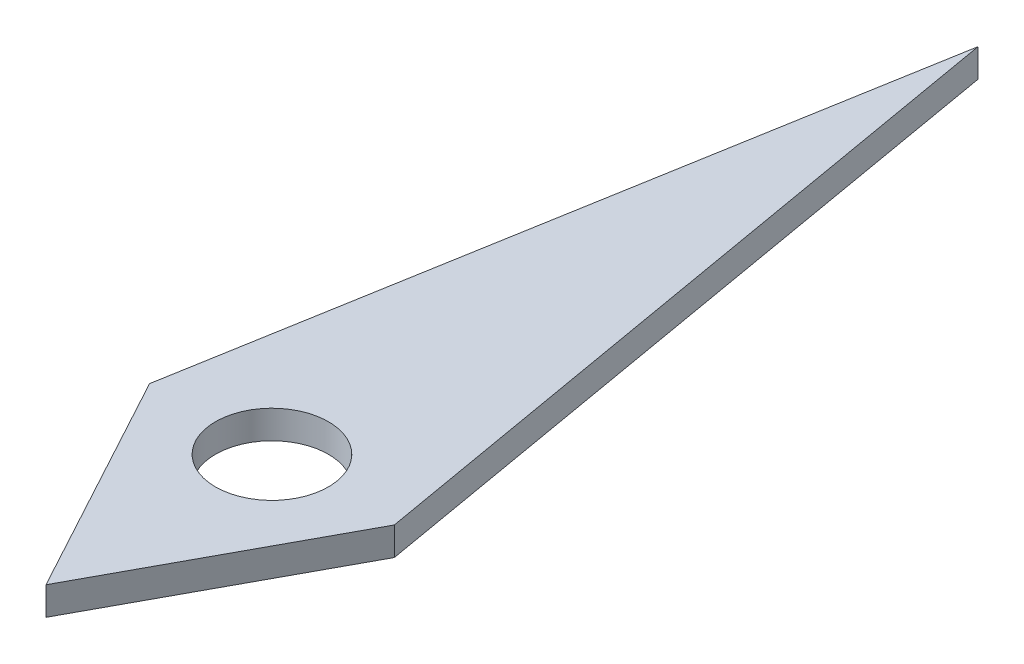
ISO-10303-21;
HEADER;
FILE_DESCRIPTION(('STEP AP214'),'2;1');
FILE_NAME('part.step','',(''),(''),'','','');
FILE_SCHEMA(('AUTOMOTIVE_DESIGN { 1 0 10303 214 1 1 1 1 }'));
ENDSEC;
DATA;
#1=APPLICATION_CONTEXT('core data for automotive mechanical design processes');
#2=APPLICATION_PROTOCOL_DEFINITION('international standard','automotive_design',2000,#1);
#3=PRODUCT_CONTEXT('',#1,'mechanical');
#4=PRODUCT('Part','Part','',(#3));
#5=PRODUCT_RELATED_PRODUCT_CATEGORY('part','',(#4));
#6=PRODUCT_DEFINITION_FORMATION('','',#4);
#7=PRODUCT_DEFINITION_CONTEXT('part definition',#1,'design');
#8=PRODUCT_DEFINITION('design','',#6,#7);
#9=PRODUCT_DEFINITION_SHAPE('','',#8);
#10=(LENGTH_UNIT() NAMED_UNIT(*) SI_UNIT(.MILLI.,.METRE.));
#11=(NAMED_UNIT(*) PLANE_ANGLE_UNIT() SI_UNIT($,.RADIAN.));
#12=(NAMED_UNIT(*) SI_UNIT($,.STERADIAN.) SOLID_ANGLE_UNIT());
#13=UNCERTAINTY_MEASURE_WITH_UNIT(LENGTH_MEASURE(1.E-05),#10,'distance_accuracy_value','');
#14=(GEOMETRIC_REPRESENTATION_CONTEXT(3) GLOBAL_UNCERTAINTY_ASSIGNED_CONTEXT((#13)) GLOBAL_UNIT_ASSIGNED_CONTEXT((#10,
#11,#12)) REPRESENTATION_CONTEXT('',''));
#15=CARTESIAN_POINT('',(0.,0.,0.));
#16=DIRECTION('',(0.,0.,1.));
#17=DIRECTION('',(1.,0.,0.));
#18=AXIS2_PLACEMENT_3D('',#15,#16,#17);
#19=CARTESIAN_POINT('',(0.,0.3,-7.5));
#20=DIRECTION('',(-0.985308020399641,0.,0.170786723535938));
#21=DIRECTION('',(0.170786723535938,0.,0.985308020399641));
#22=AXIS2_PLACEMENT_3D('',#19,#20,#21);
#23=PLANE('',#22);
#24=DIRECTION('',(-0.170786723535938,0.,-0.985308020399641));
#25=VECTOR('',#24,1.);
#26=CARTESIAN_POINT('',(0.,0.,-7.5));
#27=LINE('',#26,#25);
#28=CARTESIAN_POINT('',(1.3,0.,0.));
#29=VERTEX_POINT('',#28);
#30=CARTESIAN_POINT('',(0.,0.,-7.5));
#31=VERTEX_POINT('',#30);
#32=EDGE_CURVE('E96',#29,#31,#27,.T.);
#33=ORIENTED_EDGE('',*,*,#32,.T.);
#34=DIRECTION('',(0.,-1.,0.));
#35=VECTOR('',#34,1.);
#36=CARTESIAN_POINT('',(0.,0.3,-7.5));
#37=LINE('',#36,#35);
#38=CARTESIAN_POINT('',(0.,0.3,-7.5));
#39=VERTEX_POINT('',#38);
#40=EDGE_CURVE('E11',#39,#31,#37,.T.);
#41=ORIENTED_EDGE('',*,*,#40,.F.);
#42=DIRECTION('',(-0.170786723535938,0.,-0.985308020399641));
#43=VECTOR('',#42,1.);
#44=CARTESIAN_POINT('',(0.,0.3,-7.5));
#45=LINE('',#44,#43);
#46=CARTESIAN_POINT('',(1.3,0.3,0.));
#47=VERTEX_POINT('',#46);
#48=EDGE_CURVE('E84',#47,#39,#45,.T.);
#49=ORIENTED_EDGE('',*,*,#48,.F.);
#50=DIRECTION('',(0.,-1.,0.));
#51=VECTOR('',#50,1.);
#52=CARTESIAN_POINT('',(1.3,0.3,0.));
#53=LINE('',#52,#51);
#54=EDGE_CURVE('E92',#47,#29,#53,.T.);
#55=ORIENTED_EDGE('',*,*,#54,.T.);
#56=EDGE_LOOP('',(#33,#41,#49,#55));
#57=FACE_BOUND('',#56,.T.);
#58=ADVANCED_FACE('F33',(#57),#23,.F.);
#59=CARTESIAN_POINT('',(-1.3,0.3,0.));
#60=DIRECTION('',(0.985308020399641,0.,0.170786723535938));
#61=DIRECTION('',(0.170786723535938,0.,-0.985308020399641));
#62=AXIS2_PLACEMENT_3D('',#59,#60,#61);
#63=PLANE('',#62);
#64=DIRECTION('',(-0.170786723535938,0.,0.985308020399641));
#65=VECTOR('',#64,1.);
#66=CARTESIAN_POINT('',(-1.3,0.,0.));
#67=LINE('',#66,#65);
#68=CARTESIAN_POINT('',(-1.3,0.,0.));
#69=VERTEX_POINT('',#68);
#70=EDGE_CURVE('E88',#31,#69,#67,.T.);
#71=ORIENTED_EDGE('',*,*,#70,.T.);
#72=DIRECTION('',(0.,-1.,0.));
#73=VECTOR('',#72,1.);
#74=CARTESIAN_POINT('',(-1.3,0.3,0.));
#75=LINE('',#74,#73);
#76=CARTESIAN_POINT('',(-1.3,0.3,0.));
#77=VERTEX_POINT('',#76);
#78=EDGE_CURVE('E41',#77,#69,#75,.T.);
#79=ORIENTED_EDGE('',*,*,#78,.F.);
#80=DIRECTION('',(-0.170786723535938,0.,0.985308020399641));
#81=VECTOR('',#80,1.);
#82=CARTESIAN_POINT('',(-1.3,0.3,0.));
#83=LINE('',#82,#81);
#84=EDGE_CURVE('E79',#39,#77,#83,.T.);
#85=ORIENTED_EDGE('',*,*,#84,.F.);
#86=ORIENTED_EDGE('',*,*,#40,.T.);
#87=EDGE_LOOP('',(#71,#79,#85,#86));
#88=FACE_BOUND('',#87,.T.);
#89=ADVANCED_FACE('F87',(#88),#63,.F.);
#90=CARTESIAN_POINT('',(0.,0.3,2.4));
#91=DIRECTION('',(0.879291966536774,0.,-0.476283148540753));
#92=DIRECTION('',(-0.476283148540753,0.,-0.879291966536774));
#93=AXIS2_PLACEMENT_3D('',#90,#91,#92);
#94=PLANE('',#93);
#95=DIRECTION('',(0.476283148540753,0.,0.879291966536774));
#96=VECTOR('',#95,1.);
#97=CARTESIAN_POINT('',(0.,0.,2.4));
#98=LINE('',#97,#96);
#99=CARTESIAN_POINT('',(0.,0.,2.4));
#100=VERTEX_POINT('',#99);
#101=EDGE_CURVE('E66',#69,#100,#98,.T.);
#102=ORIENTED_EDGE('',*,*,#101,.T.);
#103=DIRECTION('',(0.,-1.,0.));
#104=VECTOR('',#103,1.);
#105=CARTESIAN_POINT('',(0.,0.3,2.4));
#106=LINE('',#105,#104);
#107=CARTESIAN_POINT('',(0.,0.3,2.4));
#108=VERTEX_POINT('',#107);
#109=EDGE_CURVE('E89',#108,#100,#106,.T.);
#110=ORIENTED_EDGE('',*,*,#109,.F.);
#111=DIRECTION('',(0.476283148540753,0.,0.879291966536774));
#112=VECTOR('',#111,1.);
#113=CARTESIAN_POINT('',(0.,0.3,2.4));
#114=LINE('',#113,#112);
#115=EDGE_CURVE('E82',#77,#108,#114,.T.);
#116=ORIENTED_EDGE('',*,*,#115,.F.);
#117=ORIENTED_EDGE('',*,*,#78,.T.);
#118=EDGE_LOOP('',(#102,#110,#116,#117));
#119=FACE_BOUND('',#118,.T.);
#120=ADVANCED_FACE('F90',(#119),#94,.F.);
#121=CARTESIAN_POINT('',(0.,0.3,2.4));
#122=DIRECTION('',(-0.879291966536774,0.,-0.476283148540753));
#123=DIRECTION('',(-0.476283148540753,0.,0.879291966536774));
#124=AXIS2_PLACEMENT_3D('',#121,#122,#123);
#125=PLANE('',#124);
#126=DIRECTION('',(0.476283148540753,0.,-0.879291966536774));
#127=VECTOR('',#126,1.);
#128=CARTESIAN_POINT('',(0.,0.,2.4));
#129=LINE('',#128,#127);
#130=EDGE_CURVE('E72',#100,#29,#129,.T.);
#131=ORIENTED_EDGE('',*,*,#130,.T.);
#132=ORIENTED_EDGE('',*,*,#54,.F.);
#133=DIRECTION('',(0.476283148540753,0.,-0.879291966536774));
#134=VECTOR('',#133,1.);
#135=CARTESIAN_POINT('',(0.,0.3,2.4));
#136=LINE('',#135,#134);
#137=EDGE_CURVE('E49',#108,#47,#136,.T.);
#138=ORIENTED_EDGE('',*,*,#137,.F.);
#139=ORIENTED_EDGE('',*,*,#109,.T.);
#140=EDGE_LOOP('',(#131,#132,#138,#139));
#141=FACE_BOUND('',#140,.T.);
#142=ADVANCED_FACE('F104',(#141),#125,.F.);
#143=CARTESIAN_POINT('',(0.,0.3,0.));
#144=DIRECTION('',(0.,1.,0.));
#145=DIRECTION('',(0.,0.,1.));
#146=AXIS2_PLACEMENT_3D('',#143,#144,#145);
#147=PLANE('',#146);
#148=CARTESIAN_POINT('',(0.,0.3,0.));
#149=DIRECTION('',(0.,1.,0.));
#150=DIRECTION('',(0.,0.,1.));
#151=AXIS2_PLACEMENT_3D('',#148,#149,#150);
#152=CIRCLE('',#151,0.6);
#153=CARTESIAN_POINT('',(0.,0.3,0.6));
#154=VERTEX_POINT('',#153);
#155=EDGE_CURVE('E110',#154,#154,#152,.T.);
#156=ORIENTED_EDGE('',*,*,#155,.F.);
#157=EDGE_LOOP('',(#156));
#158=FACE_BOUND('',#157,.T.);
#159=ORIENTED_EDGE('',*,*,#48,.T.);
#160=ORIENTED_EDGE('',*,*,#84,.T.);
#161=ORIENTED_EDGE('',*,*,#115,.T.);
#162=ORIENTED_EDGE('',*,*,#137,.T.);
#163=EDGE_LOOP('',(#159,#160,#161,#162));
#164=FACE_BOUND('',#163,.T.);
#165=ADVANCED_FACE('F80',(#158,#164),#147,.T.);
#166=CARTESIAN_POINT('',(0.,0.,0.));
#167=DIRECTION('',(0.,1.,0.));
#168=DIRECTION('',(0.,0.,1.));
#169=AXIS2_PLACEMENT_3D('',#166,#167,#168);
#170=PLANE('',#169);
#171=CARTESIAN_POINT('',(0.,0.,0.));
#172=DIRECTION('',(0.,1.,0.));
#173=DIRECTION('',(0.,0.,1.));
#174=AXIS2_PLACEMENT_3D('',#171,#172,#173);
#175=CIRCLE('',#174,0.6);
#176=CARTESIAN_POINT('',(0.,0.,0.6));
#177=VERTEX_POINT('',#176);
#178=EDGE_CURVE('E99',#177,#177,#175,.T.);
#179=ORIENTED_EDGE('',*,*,#178,.T.);
#180=EDGE_LOOP('',(#179));
#181=FACE_BOUND('',#180,.T.);
#182=ORIENTED_EDGE('',*,*,#32,.F.);
#183=ORIENTED_EDGE('',*,*,#130,.F.);
#184=ORIENTED_EDGE('',*,*,#101,.F.);
#185=ORIENTED_EDGE('',*,*,#70,.F.);
#186=EDGE_LOOP('',(#182,#183,#184,#185));
#187=FACE_BOUND('',#186,.T.);
#188=ADVANCED_FACE('F107',(#181,#187),#170,.F.);
#189=CARTESIAN_POINT('',(0.,0.,0.));
#190=DIRECTION('',(0.,1.,0.));
#191=DIRECTION('',(0.,0.,1.));
#192=AXIS2_PLACEMENT_3D('',#189,#190,#191);
#193=CYLINDRICAL_SURFACE('',#192,0.6);
#194=ORIENTED_EDGE('',*,*,#178,.F.);
#195=EDGE_LOOP('',(#194));
#196=FACE_BOUND('',#195,.T.);
#197=ORIENTED_EDGE('',*,*,#155,.T.);
#198=EDGE_LOOP('',(#197));
#199=FACE_BOUND('',#198,.T.);
#200=ADVANCED_FACE('F117',(#196,#199),#193,.F.);
#201=CLOSED_SHELL('',(#58,#89,#120,#142,#165,#188,#200));
#202=MANIFOLD_SOLID_BREP('B2',#201);
#203=ADVANCED_BREP_SHAPE_REPRESENTATION('',(#18,#202),#14);
#204=SHAPE_DEFINITION_REPRESENTATION(#9,#203);
ENDSEC;
END-ISO-10303-21;
